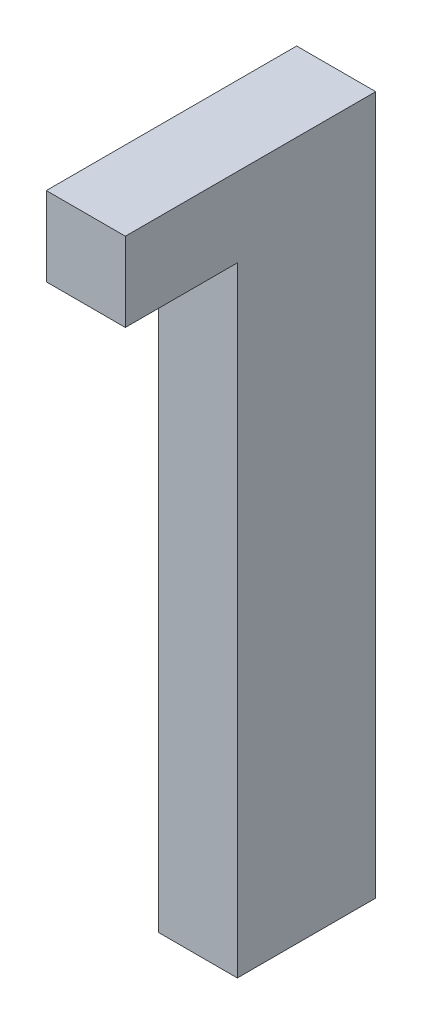
ISO-10303-21;
HEADER;
FILE_DESCRIPTION(('STEP AP214'),'2;1');
FILE_NAME('part.step','',(''),(''),'','','');
FILE_SCHEMA(('AUTOMOTIVE_DESIGN { 1 0 10303 214 1 1 1 1 }'));
ENDSEC;
DATA;
#1=APPLICATION_CONTEXT('core data for automotive mechanical design processes');
#2=APPLICATION_PROTOCOL_DEFINITION('international standard','automotive_design',2000,#1);
#3=PRODUCT_CONTEXT('',#1,'mechanical');
#4=PRODUCT('Part','Part','',(#3));
#5=PRODUCT_RELATED_PRODUCT_CATEGORY('part','',(#4));
#6=PRODUCT_DEFINITION_FORMATION('','',#4);
#7=PRODUCT_DEFINITION_CONTEXT('part definition',#1,'design');
#8=PRODUCT_DEFINITION('design','',#6,#7);
#9=PRODUCT_DEFINITION_SHAPE('','',#8);
#10=(LENGTH_UNIT() NAMED_UNIT(*) SI_UNIT(.MILLI.,.METRE.));
#11=(NAMED_UNIT(*) PLANE_ANGLE_UNIT() SI_UNIT($,.RADIAN.));
#12=(NAMED_UNIT(*) SI_UNIT($,.STERADIAN.) SOLID_ANGLE_UNIT());
#13=UNCERTAINTY_MEASURE_WITH_UNIT(LENGTH_MEASURE(1.E-05),#10,'distance_accuracy_value','');
#14=(GEOMETRIC_REPRESENTATION_CONTEXT(3) GLOBAL_UNCERTAINTY_ASSIGNED_CONTEXT((#13)) GLOBAL_UNIT_ASSIGNED_CONTEXT((#10,
#11,#12)) REPRESENTATION_CONTEXT('',''));
#15=CARTESIAN_POINT('',(0.,0.,0.));
#16=DIRECTION('',(0.,0.,1.));
#17=DIRECTION('',(1.,0.,0.));
#18=AXIS2_PLACEMENT_3D('',#15,#16,#17);
#19=CARTESIAN_POINT('',(-25.1199528241078,673.1,-219.677762126084));
#20=DIRECTION('',(1.,0.,0.));
#21=DIRECTION('',(0.,0.,-1.));
#22=AXIS2_PLACEMENT_3D('',#19,#20,#21);
#23=PLANE('',#22);
#24=DIRECTION('',(0.,1.,0.));
#25=VECTOR('',#24,1.);
#26=CARTESIAN_POINT('',(-25.1199528241078,673.1,-86.3277621260844));
#27=LINE('',#26,#25);
#28=CARTESIAN_POINT('',(-25.1199528241078,0.,-86.3277621260846));
#29=VERTEX_POINT('',#28);
#30=CARTESIAN_POINT('',(-25.1199528241078,596.9,-86.3277621260844));
#31=VERTEX_POINT('',#30);
#32=EDGE_CURVE('E64',#29,#31,#27,.T.);
#33=ORIENTED_EDGE('',*,*,#32,.T.);
#34=DIRECTION('',(0.,0.,1.));
#35=VECTOR('',#34,1.);
#36=CARTESIAN_POINT('',(-25.1199528241078,596.9,-219.677762126084));
#37=LINE('',#36,#35);
#38=CARTESIAN_POINT('',(-25.1199528241078,596.9,21.6222378739155));
#39=VERTEX_POINT('',#38);
#40=EDGE_CURVE('E134',#31,#39,#37,.T.);
#41=ORIENTED_EDGE('',*,*,#40,.T.);
#42=DIRECTION('',(0.,-1.,0.));
#43=VECTOR('',#42,1.);
#44=CARTESIAN_POINT('',(-25.1199528241078,673.1,21.6222378739155));
#45=LINE('',#44,#43);
#46=CARTESIAN_POINT('',(-25.1199528241078,673.1,21.6222378739155));
#47=VERTEX_POINT('',#46);
#48=EDGE_CURVE('E57',#47,#39,#45,.T.);
#49=ORIENTED_EDGE('',*,*,#48,.F.);
#50=DIRECTION('',(0.,0.,1.));
#51=VECTOR('',#50,1.);
#52=CARTESIAN_POINT('',(-25.1199528241078,673.1,-219.677762126084));
#53=LINE('',#52,#51);
#54=CARTESIAN_POINT('',(-25.1199528241078,673.1,-219.677762126084));
#55=VERTEX_POINT('',#54);
#56=EDGE_CURVE('E132',#55,#47,#53,.T.);
#57=ORIENTED_EDGE('',*,*,#56,.F.);
#58=DIRECTION('',(0.,-1.,0.));
#59=VECTOR('',#58,1.);
#60=CARTESIAN_POINT('',(-25.1199528241078,673.1,-219.677762126084));
#61=LINE('',#60,#59);
#62=CARTESIAN_POINT('',(-25.1199528241078,0.,-219.677762126084));
#63=VERTEX_POINT('',#62);
#64=EDGE_CURVE('E138',#55,#63,#61,.T.);
#65=ORIENTED_EDGE('',*,*,#64,.T.);
#66=DIRECTION('',(0.,0.,1.));
#67=VECTOR('',#66,1.);
#68=CARTESIAN_POINT('',(-25.1199528241078,0.,-219.677762126084));
#69=LINE('',#68,#67);
#70=EDGE_CURVE('E128',#63,#29,#69,.T.);
#71=ORIENTED_EDGE('',*,*,#70,.T.);
#72=EDGE_LOOP('',(#33,#41,#49,#57,#65,#71));
#73=FACE_BOUND('',#72,.T.);
#74=ADVANCED_FACE('F49',(#73),#23,.F.);
#75=CARTESIAN_POINT('',(-25.1199528241078,673.1,21.6222378739155));
#76=DIRECTION('',(0.,0.,-1.));
#77=DIRECTION('',(-1.,0.,0.));
#78=AXIS2_PLACEMENT_3D('',#75,#76,#77);
#79=PLANE('',#78);
#80=ORIENTED_EDGE('',*,*,#48,.T.);
#81=DIRECTION('',(1.,0.,0.));
#82=VECTOR('',#81,1.);
#83=CARTESIAN_POINT('',(-75.9199528241078,596.9,21.6222378739156));
#84=LINE('',#83,#82);
#85=CARTESIAN_POINT('',(51.0800471758922,596.9,21.6222378739155));
#86=VERTEX_POINT('',#85);
#87=EDGE_CURVE('E150',#39,#86,#84,.T.);
#88=ORIENTED_EDGE('',*,*,#87,.T.);
#89=DIRECTION('',(0.,-1.,0.));
#90=VECTOR('',#89,1.);
#91=CARTESIAN_POINT('',(51.0800471758922,673.1,21.6222378739155));
#92=LINE('',#91,#90);
#93=CARTESIAN_POINT('',(51.0800471758922,673.1,21.6222378739155));
#94=VERTEX_POINT('',#93);
#95=EDGE_CURVE('E144',#94,#86,#92,.T.);
#96=ORIENTED_EDGE('',*,*,#95,.F.);
#97=DIRECTION('',(1.,0.,0.));
#98=VECTOR('',#97,1.);
#99=CARTESIAN_POINT('',(-25.1199528241078,673.1,21.6222378739155));
#100=LINE('',#99,#98);
#101=EDGE_CURVE('E95',#47,#94,#100,.T.);
#102=ORIENTED_EDGE('',*,*,#101,.F.);
#103=EDGE_LOOP('',(#80,#88,#96,#102));
#104=FACE_BOUND('',#103,.T.);
#105=ADVANCED_FACE('F149',(#104),#79,.F.);
#106=CARTESIAN_POINT('',(51.0800471758922,673.1,-219.677762126084));
#107=DIRECTION('',(-1.,0.,0.));
#108=DIRECTION('',(0.,0.,1.));
#109=AXIS2_PLACEMENT_3D('',#106,#107,#108);
#110=PLANE('',#109);
#111=ORIENTED_EDGE('',*,*,#95,.T.);
#112=DIRECTION('',(0.,0.,1.));
#113=VECTOR('',#112,1.);
#114=CARTESIAN_POINT('',(51.0800471758922,596.9,21.6222378739155));
#115=LINE('',#114,#113);
#116=CARTESIAN_POINT('',(51.0800471758922,596.9,-86.3277621260845));
#117=VERTEX_POINT('',#116);
#118=EDGE_CURVE('E123',#117,#86,#115,.T.);
#119=ORIENTED_EDGE('',*,*,#118,.F.);
#120=DIRECTION('',(0.,1.,0.));
#121=VECTOR('',#120,1.);
#122=CARTESIAN_POINT('',(51.0800471758922,596.9,-86.3277621260845));
#123=LINE('',#122,#121);
#124=CARTESIAN_POINT('',(51.0800471758922,0.,-86.3277621260845));
#125=VERTEX_POINT('',#124);
#126=EDGE_CURVE('E112',#125,#117,#123,.T.);
#127=ORIENTED_EDGE('',*,*,#126,.F.);
#128=DIRECTION('',(0.,0.,-1.));
#129=VECTOR('',#128,1.);
#130=CARTESIAN_POINT('',(51.0800471758922,0.,-219.677762126084));
#131=LINE('',#130,#129);
#132=CARTESIAN_POINT('',(51.0800471758922,0.,-219.677762126084));
#133=VERTEX_POINT('',#132);
#134=EDGE_CURVE('E122',#125,#133,#131,.T.);
#135=ORIENTED_EDGE('',*,*,#134,.T.);
#136=DIRECTION('',(0.,-1.,0.));
#137=VECTOR('',#136,1.);
#138=CARTESIAN_POINT('',(51.0800471758922,673.1,-219.677762126084));
#139=LINE('',#138,#137);
#140=CARTESIAN_POINT('',(51.0800471758922,673.1,-219.677762126084));
#141=VERTEX_POINT('',#140);
#142=EDGE_CURVE('E141',#141,#133,#139,.T.);
#143=ORIENTED_EDGE('',*,*,#142,.F.);
#144=DIRECTION('',(0.,0.,-1.));
#145=VECTOR('',#144,1.);
#146=CARTESIAN_POINT('',(51.0800471758922,673.1,-219.677762126084));
#147=LINE('',#146,#145);
#148=EDGE_CURVE('E165',#94,#141,#147,.T.);
#149=ORIENTED_EDGE('',*,*,#148,.F.);
#150=EDGE_LOOP('',(#111,#119,#127,#135,#143,#149));
#151=FACE_BOUND('',#150,.T.);
#152=ADVANCED_FACE('F120',(#151),#110,.F.);
#153=CARTESIAN_POINT('',(-25.1199528241078,673.1,-219.677762126084));
#154=DIRECTION('',(0.,0.,1.));
#155=DIRECTION('',(1.,0.,0.));
#156=AXIS2_PLACEMENT_3D('',#153,#154,#155);
#157=PLANE('',#156);
#158=DIRECTION('',(-1.,0.,0.));
#159=VECTOR('',#158,1.);
#160=CARTESIAN_POINT('',(-25.1199528241078,0.,-219.677762126084));
#161=LINE('',#160,#159);
#162=EDGE_CURVE('E87',#133,#63,#161,.T.);
#163=ORIENTED_EDGE('',*,*,#162,.T.);
#164=ORIENTED_EDGE('',*,*,#64,.F.);
#165=DIRECTION('',(-1.,0.,0.));
#166=VECTOR('',#165,1.);
#167=CARTESIAN_POINT('',(-25.1199528241078,673.1,-219.677762126084));
#168=LINE('',#167,#166);
#169=EDGE_CURVE('E72',#141,#55,#168,.T.);
#170=ORIENTED_EDGE('',*,*,#169,.F.);
#171=ORIENTED_EDGE('',*,*,#142,.T.);
#172=EDGE_LOOP('',(#163,#164,#170,#171));
#173=FACE_BOUND('',#172,.T.);
#174=ADVANCED_FACE('F170',(#173),#157,.F.);
#175=CARTESIAN_POINT('',(0.,673.1,0.));
#176=DIRECTION('',(0.,1.,0.));
#177=DIRECTION('',(0.,0.,1.));
#178=AXIS2_PLACEMENT_3D('',#175,#176,#177);
#179=PLANE('',#178);
#180=ORIENTED_EDGE('',*,*,#56,.T.);
#181=ORIENTED_EDGE('',*,*,#101,.T.);
#182=ORIENTED_EDGE('',*,*,#148,.T.);
#183=ORIENTED_EDGE('',*,*,#169,.T.);
#184=EDGE_LOOP('',(#180,#181,#182,#183));
#185=FACE_BOUND('',#184,.T.);
#186=ADVANCED_FACE('F169',(#185),#179,.T.);
#187=CARTESIAN_POINT('',(0.,0.,0.));
#188=DIRECTION('',(0.,1.,0.));
#189=DIRECTION('',(0.,0.,1.));
#190=AXIS2_PLACEMENT_3D('',#187,#188,#189);
#191=PLANE('',#190);
#192=ORIENTED_EDGE('',*,*,#134,.F.);
#193=DIRECTION('',(-1.,0.,0.));
#194=VECTOR('',#193,1.);
#195=CARTESIAN_POINT('',(0.,0.,-86.3277621260845));
#196=LINE('',#195,#194);
#197=EDGE_CURVE('E11',#125,#29,#196,.T.);
#198=ORIENTED_EDGE('',*,*,#197,.T.);
#199=ORIENTED_EDGE('',*,*,#70,.F.);
#200=ORIENTED_EDGE('',*,*,#162,.F.);
#201=EDGE_LOOP('',(#192,#198,#199,#200));
#202=FACE_BOUND('',#201,.T.);
#203=ADVANCED_FACE('F126',(#202),#191,.F.);
#204=CARTESIAN_POINT('',(-75.9199528241078,596.9,21.6222378739156));
#205=DIRECTION('',(0.,1.,0.));
#206=DIRECTION('',(0.,0.,1.));
#207=AXIS2_PLACEMENT_3D('',#204,#205,#206);
#208=PLANE('',#207);
#209=DIRECTION('',(1.,0.,0.));
#210=VECTOR('',#209,1.);
#211=CARTESIAN_POINT('',(-75.9199528241078,596.9,-86.3277621260844));
#212=LINE('',#211,#210);
#213=EDGE_CURVE('E266',#31,#117,#212,.T.);
#214=ORIENTED_EDGE('',*,*,#213,.T.);
#215=ORIENTED_EDGE('',*,*,#118,.T.);
#216=ORIENTED_EDGE('',*,*,#87,.F.);
#217=ORIENTED_EDGE('',*,*,#40,.F.);
#218=EDGE_LOOP('',(#214,#215,#216,#217));
#219=FACE_BOUND('',#218,.T.);
#220=ADVANCED_FACE('F210',(#219),#208,.F.);
#221=CARTESIAN_POINT('',(-75.9199528241078,596.9,-86.3277621260844));
#222=DIRECTION('',(0.,0.,-1.));
#223=DIRECTION('',(-1.,0.,0.));
#224=AXIS2_PLACEMENT_3D('',#221,#222,#223);
#225=PLANE('',#224);
#226=ORIENTED_EDGE('',*,*,#197,.F.);
#227=ORIENTED_EDGE('',*,*,#126,.T.);
#228=ORIENTED_EDGE('',*,*,#213,.F.);
#229=ORIENTED_EDGE('',*,*,#32,.F.);
#230=EDGE_LOOP('',(#226,#227,#228,#229));
#231=FACE_BOUND('',#230,.T.);
#232=ADVANCED_FACE('F111',(#231),#225,.F.);
#233=CLOSED_SHELL('',(#74,#105,#152,#174,#186,#203,#220,#232));
#234=MANIFOLD_SOLID_BREP('B2',#233);
#235=ADVANCED_BREP_SHAPE_REPRESENTATION('',(#18,#234),#14);
#236=SHAPE_DEFINITION_REPRESENTATION(#9,#235);
ENDSEC;
END-ISO-10303-21;
